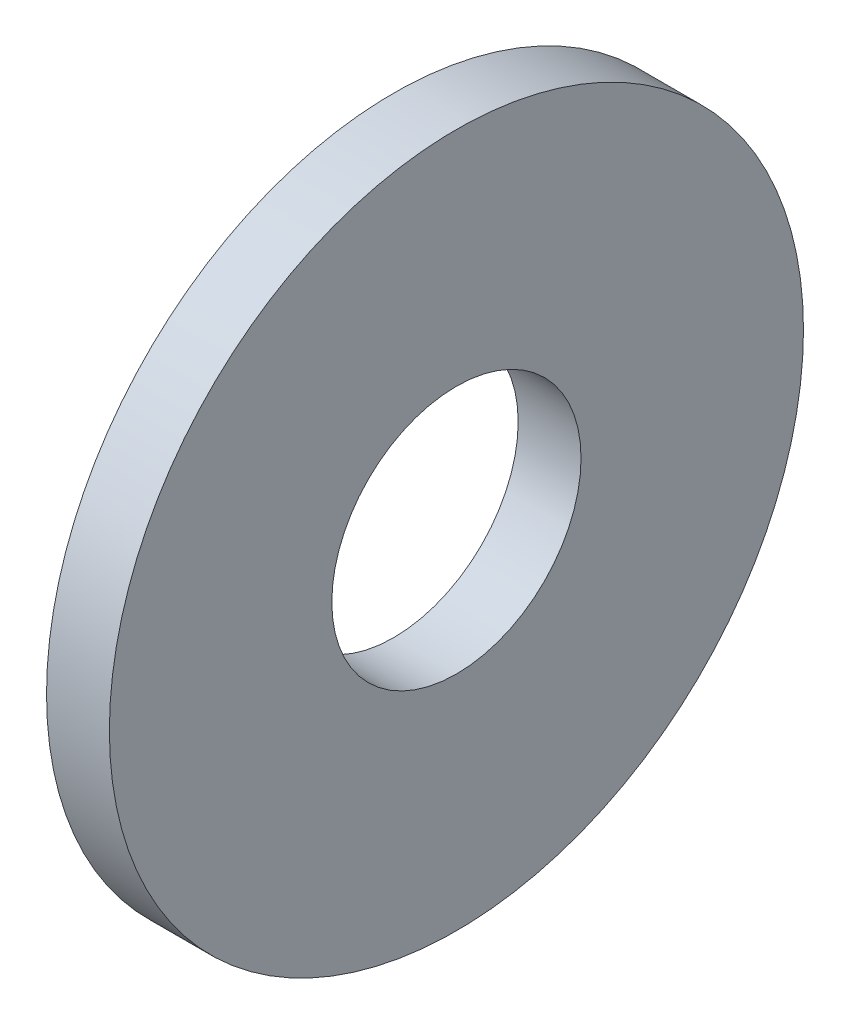
ISO-10303-21;
HEADER;
FILE_DESCRIPTION(('STEP AP214'),'2;1');
FILE_NAME('part.step','',(''),(''),'','','');
FILE_SCHEMA(('AUTOMOTIVE_DESIGN { 1 0 10303 214 1 1 1 1 }'));
ENDSEC;
DATA;
#1=APPLICATION_CONTEXT('core data for automotive mechanical design processes');
#2=APPLICATION_PROTOCOL_DEFINITION('international standard','automotive_design',2000,#1);
#3=PRODUCT_CONTEXT('',#1,'mechanical');
#4=PRODUCT('Part','Part','',(#3));
#5=PRODUCT_RELATED_PRODUCT_CATEGORY('part','',(#4));
#6=PRODUCT_DEFINITION_FORMATION('','',#4);
#7=PRODUCT_DEFINITION_CONTEXT('part definition',#1,'design');
#8=PRODUCT_DEFINITION('design','',#6,#7);
#9=PRODUCT_DEFINITION_SHAPE('','',#8);
#10=(LENGTH_UNIT() NAMED_UNIT(*) SI_UNIT(.MILLI.,.METRE.));
#11=(NAMED_UNIT(*) PLANE_ANGLE_UNIT() SI_UNIT($,.RADIAN.));
#12=(NAMED_UNIT(*) SI_UNIT($,.STERADIAN.) SOLID_ANGLE_UNIT());
#13=UNCERTAINTY_MEASURE_WITH_UNIT(LENGTH_MEASURE(1.E-05),#10,'distance_accuracy_value','');
#14=(GEOMETRIC_REPRESENTATION_CONTEXT(3) GLOBAL_UNCERTAINTY_ASSIGNED_CONTEXT((#13)) GLOBAL_UNIT_ASSIGNED_CONTEXT((#10,
#11,#12)) REPRESENTATION_CONTEXT('',''));
#15=CARTESIAN_POINT('',(0.,0.,0.));
#16=DIRECTION('',(0.,0.,1.));
#17=DIRECTION('',(1.,0.,0.));
#18=AXIS2_PLACEMENT_3D('',#15,#16,#17);
#19=CARTESIAN_POINT('',(-34.9249999999999,0.,0.));
#20=DIRECTION('',(-1.,0.,0.));
#21=DIRECTION('',(0.,0.,1.));
#22=AXIS2_PLACEMENT_3D('',#19,#20,#21);
#23=CYLINDRICAL_SURFACE('',#22,4.56);
#24=CARTESIAN_POINT('',(0.,0.,0.));
#25=DIRECTION('',(-1.,0.,0.));
#26=DIRECTION('',(0.,0.,1.));
#27=AXIS2_PLACEMENT_3D('',#24,#25,#26);
#28=CIRCLE('',#27,4.56);
#29=CARTESIAN_POINT('',(0.,0.,4.56));
#30=VERTEX_POINT('',#29);
#31=EDGE_CURVE('E10',#30,#30,#28,.T.);
#32=ORIENTED_EDGE('',*,*,#31,.F.);
#33=EDGE_LOOP('',(#32));
#34=FACE_BOUND('',#33,.T.);
#35=CARTESIAN_POINT('',(-2.3,0.,0.));
#36=DIRECTION('',(-1.,0.,0.));
#37=DIRECTION('',(0.,0.,1.));
#38=AXIS2_PLACEMENT_3D('',#35,#36,#37);
#39=CIRCLE('',#38,4.56);
#40=CARTESIAN_POINT('',(-2.3,0.,4.56));
#41=VERTEX_POINT('',#40);
#42=EDGE_CURVE('E49',#41,#41,#39,.T.);
#43=ORIENTED_EDGE('',*,*,#42,.T.);
#44=EDGE_LOOP('',(#43));
#45=FACE_BOUND('',#44,.T.);
#46=ADVANCED_FACE('F35',(#34,#45),#23,.F.);
#47=CARTESIAN_POINT('',(0.,4.56,0.));
#48=DIRECTION('',(-1.,0.,0.));
#49=DIRECTION('',(0.,0.,1.));
#50=AXIS2_PLACEMENT_3D('',#47,#48,#49);
#51=PLANE('',#50);
#52=CARTESIAN_POINT('',(0.,0.,0.));
#53=DIRECTION('',(-1.,0.,0.));
#54=DIRECTION('',(0.,0.,1.));
#55=AXIS2_PLACEMENT_3D('',#52,#53,#54);
#56=CIRCLE('',#55,12.7);
#57=CARTESIAN_POINT('',(0.,0.,12.7));
#58=VERTEX_POINT('',#57);
#59=EDGE_CURVE('E41',#58,#58,#56,.T.);
#60=ORIENTED_EDGE('',*,*,#59,.F.);
#61=EDGE_LOOP('',(#60));
#62=FACE_BOUND('',#61,.T.);
#63=ORIENTED_EDGE('',*,*,#31,.T.);
#64=EDGE_LOOP('',(#63));
#65=FACE_BOUND('',#64,.T.);
#66=ADVANCED_FACE('F64',(#62,#65),#51,.F.);
#67=CARTESIAN_POINT('',(-34.9249999999999,0.,0.));
#68=DIRECTION('',(-1.,0.,0.));
#69=DIRECTION('',(0.,0.,1.));
#70=AXIS2_PLACEMENT_3D('',#67,#68,#69);
#71=CYLINDRICAL_SURFACE('',#70,12.7);
#72=CARTESIAN_POINT('',(-2.3,0.,0.));
#73=DIRECTION('',(-1.,0.,0.));
#74=DIRECTION('',(0.,0.,1.));
#75=AXIS2_PLACEMENT_3D('',#72,#73,#74);
#76=CIRCLE('',#75,12.7);
#77=CARTESIAN_POINT('',(-2.3,0.,12.7));
#78=VERTEX_POINT('',#77);
#79=EDGE_CURVE('E45',#78,#78,#76,.T.);
#80=ORIENTED_EDGE('',*,*,#79,.F.);
#81=EDGE_LOOP('',(#80));
#82=FACE_BOUND('',#81,.T.);
#83=ORIENTED_EDGE('',*,*,#59,.T.);
#84=EDGE_LOOP('',(#83));
#85=FACE_BOUND('',#84,.T.);
#86=ADVANCED_FACE('F59',(#82,#85),#71,.T.);
#87=CARTESIAN_POINT('',(-2.3,12.7,0.));
#88=DIRECTION('',(1.,0.,0.));
#89=DIRECTION('',(0.,0.,-1.));
#90=AXIS2_PLACEMENT_3D('',#87,#88,#89);
#91=PLANE('',#90);
#92=ORIENTED_EDGE('',*,*,#42,.F.);
#93=EDGE_LOOP('',(#92));
#94=FACE_BOUND('',#93,.T.);
#95=ORIENTED_EDGE('',*,*,#79,.T.);
#96=EDGE_LOOP('',(#95));
#97=FACE_BOUND('',#96,.T.);
#98=ADVANCED_FACE('F56',(#94,#97),#91,.F.);
#99=CLOSED_SHELL('',(#46,#66,#86,#98));
#100=MANIFOLD_SOLID_BREP('B2',#99);
#101=ADVANCED_BREP_SHAPE_REPRESENTATION('',(#18,#100),#14);
#102=SHAPE_DEFINITION_REPRESENTATION(#9,#101);
ENDSEC;
END-ISO-10303-21;
